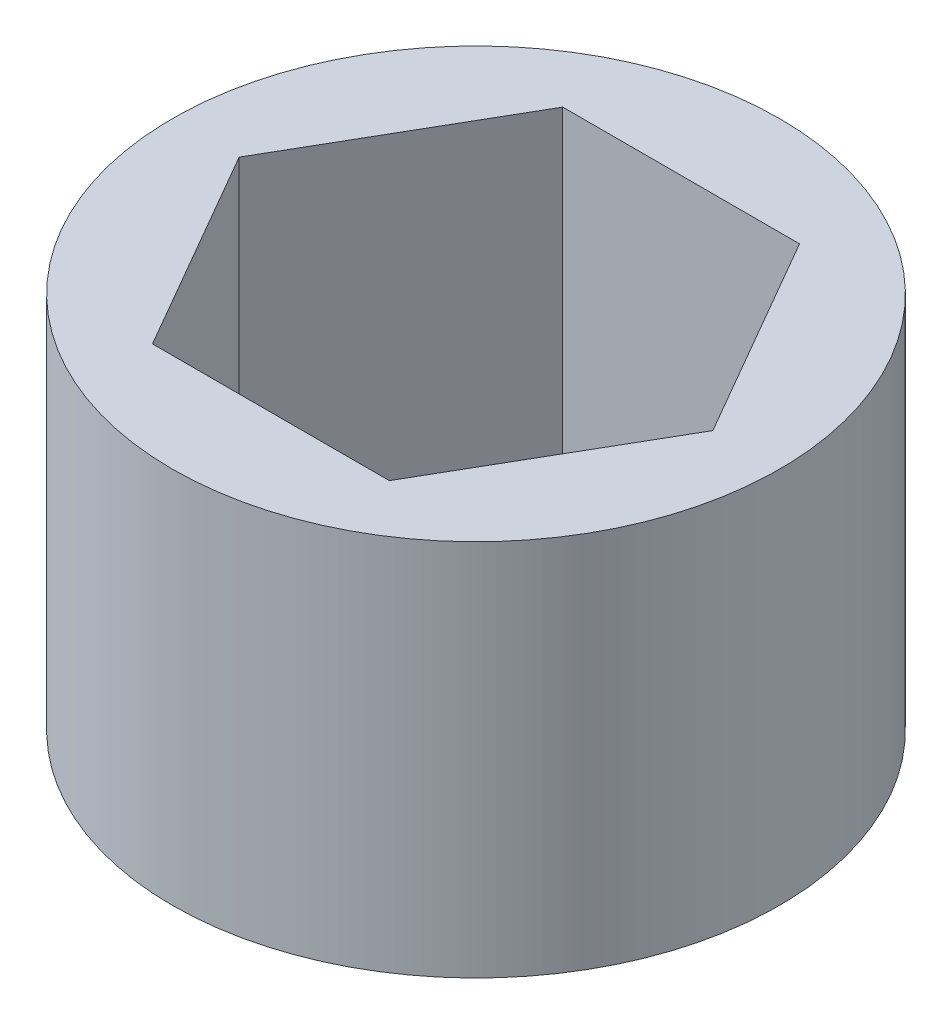
ISO-10303-21;
HEADER;
FILE_DESCRIPTION(('STEP AP214'),'2;1');
FILE_NAME('part.step','',(''),(''),'','','');
FILE_SCHEMA(('AUTOMOTIVE_DESIGN { 1 0 10303 214 1 1 1 1 }'));
ENDSEC;
DATA;
#1=APPLICATION_CONTEXT('core data for automotive mechanical design processes');
#2=APPLICATION_PROTOCOL_DEFINITION('international standard','automotive_design',2000,#1);
#3=PRODUCT_CONTEXT('',#1,'mechanical');
#4=PRODUCT('Part','Part','',(#3));
#5=PRODUCT_RELATED_PRODUCT_CATEGORY('part','',(#4));
#6=PRODUCT_DEFINITION_FORMATION('','',#4);
#7=PRODUCT_DEFINITION_CONTEXT('part definition',#1,'design');
#8=PRODUCT_DEFINITION('design','',#6,#7);
#9=PRODUCT_DEFINITION_SHAPE('','',#8);
#10=(LENGTH_UNIT() NAMED_UNIT(*) SI_UNIT(.MILLI.,.METRE.));
#11=(NAMED_UNIT(*) PLANE_ANGLE_UNIT() SI_UNIT($,.RADIAN.));
#12=(NAMED_UNIT(*) SI_UNIT($,.STERADIAN.) SOLID_ANGLE_UNIT());
#13=UNCERTAINTY_MEASURE_WITH_UNIT(LENGTH_MEASURE(1.E-05),#10,'distance_accuracy_value','');
#14=(GEOMETRIC_REPRESENTATION_CONTEXT(3) GLOBAL_UNCERTAINTY_ASSIGNED_CONTEXT((#13)) GLOBAL_UNIT_ASSIGNED_CONTEXT((#10,
#11,#12)) REPRESENTATION_CONTEXT('',''));
#15=CARTESIAN_POINT('',(0.,0.,0.));
#16=DIRECTION('',(0.,0.,1.));
#17=DIRECTION('',(1.,0.,0.));
#18=AXIS2_PLACEMENT_3D('',#15,#16,#17);
#19=CARTESIAN_POINT('',(0.,4.445,0.));
#20=DIRECTION('',(0.,1.,0.));
#21=DIRECTION('',(0.,0.,1.));
#22=AXIS2_PLACEMENT_3D('',#19,#20,#21);
#23=PLANE('',#22);
#24=CARTESIAN_POINT('',(0.,4.445,0.));
#25=DIRECTION('',(0.,1.,0.));
#26=DIRECTION('',(0.,0.,1.));
#27=AXIS2_PLACEMENT_3D('',#24,#25,#26);
#28=CIRCLE('',#27,7.14375);
#29=CARTESIAN_POINT('',(0.,4.445,7.14375));
#30=VERTEX_POINT('',#29);
#31=EDGE_CURVE('E11',#30,#30,#28,.T.);
#32=ORIENTED_EDGE('',*,*,#31,.T.);
#33=EDGE_LOOP('',(#32));
#34=FACE_BOUND('',#33,.T.);
#35=DIRECTION('',(0.5,0.,-0.866025403784439));
#36=VECTOR('',#35,1.);
#37=CARTESIAN_POINT('',(2.78629239910914,4.445,4.826));
#38=LINE('',#37,#36);
#39=CARTESIAN_POINT('',(2.78629239910914,4.445,4.826));
#40=VERTEX_POINT('',#39);
#41=CARTESIAN_POINT('',(5.57258479821827,4.445,0.));
#42=VERTEX_POINT('',#41);
#43=EDGE_CURVE('E95',#40,#42,#38,.T.);
#44=ORIENTED_EDGE('',*,*,#43,.F.);
#45=DIRECTION('',(1.,0.,0.));
#46=VECTOR('',#45,1.);
#47=CARTESIAN_POINT('',(-2.78629239910914,4.445,4.826));
#48=LINE('',#47,#46);
#49=CARTESIAN_POINT('',(-2.78629239910914,4.445,4.826));
#50=VERTEX_POINT('',#49);
#51=EDGE_CURVE('E87',#50,#40,#48,.T.);
#52=ORIENTED_EDGE('',*,*,#51,.F.);
#53=DIRECTION('',(0.5,0.,0.866025403784439));
#54=VECTOR('',#53,1.);
#55=CARTESIAN_POINT('',(-5.57258479821827,4.445,0.));
#56=LINE('',#55,#54);
#57=CARTESIAN_POINT('',(-5.57258479821827,4.445,0.));
#58=VERTEX_POINT('',#57);
#59=EDGE_CURVE('E115',#58,#50,#56,.T.);
#60=ORIENTED_EDGE('',*,*,#59,.F.);
#61=DIRECTION('',(-0.5,0.,0.866025403784439));
#62=VECTOR('',#61,1.);
#63=CARTESIAN_POINT('',(-2.78629239910914,4.445,-4.826));
#64=LINE('',#63,#62);
#65=CARTESIAN_POINT('',(-2.78629239910914,4.445,-4.826));
#66=VERTEX_POINT('',#65);
#67=EDGE_CURVE('E113',#66,#58,#64,.T.);
#68=ORIENTED_EDGE('',*,*,#67,.F.);
#69=DIRECTION('',(-1.,0.,0.));
#70=VECTOR('',#69,1.);
#71=CARTESIAN_POINT('',(2.78629239910914,4.445,-4.826));
#72=LINE('',#71,#70);
#73=CARTESIAN_POINT('',(2.78629239910914,4.445,-4.826));
#74=VERTEX_POINT('',#73);
#75=EDGE_CURVE('E109',#74,#66,#72,.T.);
#76=ORIENTED_EDGE('',*,*,#75,.F.);
#77=DIRECTION('',(-0.5,0.,-0.866025403784439));
#78=VECTOR('',#77,1.);
#79=CARTESIAN_POINT('',(5.57258479821827,4.445,0.));
#80=LINE('',#79,#78);
#81=EDGE_CURVE('E107',#42,#74,#80,.T.);
#82=ORIENTED_EDGE('',*,*,#81,.F.);
#83=EDGE_LOOP('',(#44,#52,#60,#68,#76,#82));
#84=FACE_BOUND('',#83,.T.);
#85=ADVANCED_FACE('F34',(#34,#84),#23,.T.);
#86=CARTESIAN_POINT('',(0.,-4.445,0.));
#87=DIRECTION('',(0.,1.,0.));
#88=DIRECTION('',(0.,0.,1.));
#89=AXIS2_PLACEMENT_3D('',#86,#87,#88);
#90=PLANE('',#89);
#91=CARTESIAN_POINT('',(0.,-4.445,0.));
#92=DIRECTION('',(0.,1.,0.));
#93=DIRECTION('',(0.,0.,1.));
#94=AXIS2_PLACEMENT_3D('',#91,#92,#93);
#95=CIRCLE('',#94,7.14375);
#96=CARTESIAN_POINT('',(0.,-4.445,7.14375));
#97=VERTEX_POINT('',#96);
#98=EDGE_CURVE('E38',#97,#97,#95,.T.);
#99=ORIENTED_EDGE('',*,*,#98,.F.);
#100=EDGE_LOOP('',(#99));
#101=FACE_BOUND('',#100,.T.);
#102=DIRECTION('',(1.,0.,0.));
#103=VECTOR('',#102,1.);
#104=CARTESIAN_POINT('',(-2.78629239910914,-4.445,4.826));
#105=LINE('',#104,#103);
#106=CARTESIAN_POINT('',(-2.78629239910914,-4.445,4.826));
#107=VERTEX_POINT('',#106);
#108=CARTESIAN_POINT('',(2.78629239910914,-4.445,4.826));
#109=VERTEX_POINT('',#108);
#110=EDGE_CURVE('E57',#107,#109,#105,.T.);
#111=ORIENTED_EDGE('',*,*,#110,.T.);
#112=DIRECTION('',(0.5,0.,-0.866025403784439));
#113=VECTOR('',#112,1.);
#114=CARTESIAN_POINT('',(2.78629239910914,-4.445,4.826));
#115=LINE('',#114,#113);
#116=CARTESIAN_POINT('',(5.57258479821827,-4.445,0.));
#117=VERTEX_POINT('',#116);
#118=EDGE_CURVE('E102',#109,#117,#115,.T.);
#119=ORIENTED_EDGE('',*,*,#118,.T.);
#120=DIRECTION('',(-0.5,0.,-0.866025403784439));
#121=VECTOR('',#120,1.);
#122=CARTESIAN_POINT('',(5.57258479821827,-4.445,0.));
#123=LINE('',#122,#121);
#124=CARTESIAN_POINT('',(2.78629239910914,-4.445,-4.826));
#125=VERTEX_POINT('',#124);
#126=EDGE_CURVE('E119',#117,#125,#123,.T.);
#127=ORIENTED_EDGE('',*,*,#126,.T.);
#128=DIRECTION('',(-1.,0.,0.));
#129=VECTOR('',#128,1.);
#130=CARTESIAN_POINT('',(2.78629239910914,-4.445,-4.826));
#131=LINE('',#130,#129);
#132=CARTESIAN_POINT('',(-2.78629239910914,-4.445,-4.826));
#133=VERTEX_POINT('',#132);
#134=EDGE_CURVE('E122',#125,#133,#131,.T.);
#135=ORIENTED_EDGE('',*,*,#134,.T.);
#136=DIRECTION('',(-0.5,0.,0.866025403784439));
#137=VECTOR('',#136,1.);
#138=CARTESIAN_POINT('',(-2.78629239910914,-4.445,-4.826));
#139=LINE('',#138,#137);
#140=CARTESIAN_POINT('',(-5.57258479821827,-4.445,0.));
#141=VERTEX_POINT('',#140);
#142=EDGE_CURVE('E125',#133,#141,#139,.T.);
#143=ORIENTED_EDGE('',*,*,#142,.T.);
#144=DIRECTION('',(0.5,0.,0.866025403784439));
#145=VECTOR('',#144,1.);
#146=CARTESIAN_POINT('',(-5.57258479821827,-4.445,0.));
#147=LINE('',#146,#145);
#148=EDGE_CURVE('E96',#141,#107,#147,.T.);
#149=ORIENTED_EDGE('',*,*,#148,.T.);
#150=EDGE_LOOP('',(#111,#119,#127,#135,#143,#149));
#151=FACE_BOUND('',#150,.T.);
#152=ADVANCED_FACE('F142',(#101,#151),#90,.F.);
#153=CARTESIAN_POINT('',(0.,4.445,0.));
#154=DIRECTION('',(0.,-1.,0.));
#155=DIRECTION('',(0.,0.,-1.));
#156=AXIS2_PLACEMENT_3D('',#153,#154,#155);
#157=CYLINDRICAL_SURFACE('',#156,7.14375);
#158=ORIENTED_EDGE('',*,*,#31,.F.);
#159=EDGE_LOOP('',(#158));
#160=FACE_BOUND('',#159,.T.);
#161=ORIENTED_EDGE('',*,*,#98,.T.);
#162=EDGE_LOOP('',(#161));
#163=FACE_BOUND('',#162,.T.);
#164=ADVANCED_FACE('F36',(#160,#163),#157,.T.);
#165=CARTESIAN_POINT('',(-2.78629239910914,4.445,4.826));
#166=DIRECTION('',(0.,0.,-1.));
#167=DIRECTION('',(-1.,0.,0.));
#168=AXIS2_PLACEMENT_3D('',#165,#166,#167);
#169=PLANE('',#168);
#170=ORIENTED_EDGE('',*,*,#110,.F.);
#171=DIRECTION('',(0.,-1.,0.));
#172=VECTOR('',#171,1.);
#173=CARTESIAN_POINT('',(-2.78629239910914,4.445,4.826));
#174=LINE('',#173,#172);
#175=EDGE_CURVE('E91',#50,#107,#174,.T.);
#176=ORIENTED_EDGE('',*,*,#175,.F.);
#177=ORIENTED_EDGE('',*,*,#51,.T.);
#178=DIRECTION('',(0.,-1.,0.));
#179=VECTOR('',#178,1.);
#180=CARTESIAN_POINT('',(2.78629239910914,4.445,4.826));
#181=LINE('',#180,#179);
#182=EDGE_CURVE('E90',#40,#109,#181,.T.);
#183=ORIENTED_EDGE('',*,*,#182,.T.);
#184=EDGE_LOOP('',(#170,#176,#177,#183));
#185=FACE_BOUND('',#184,.T.);
#186=ADVANCED_FACE('F89',(#185),#169,.T.);
#187=CARTESIAN_POINT('',(2.78629239910914,4.445,4.826));
#188=DIRECTION('',(-0.866025403784439,0.,-0.5));
#189=DIRECTION('',(-0.5,0.,0.866025403784439));
#190=AXIS2_PLACEMENT_3D('',#187,#188,#189);
#191=PLANE('',#190);
#192=ORIENTED_EDGE('',*,*,#118,.F.);
#193=ORIENTED_EDGE('',*,*,#182,.F.);
#194=ORIENTED_EDGE('',*,*,#43,.T.);
#195=DIRECTION('',(0.,-1.,0.));
#196=VECTOR('',#195,1.);
#197=CARTESIAN_POINT('',(5.57258479821827,4.445,0.));
#198=LINE('',#197,#196);
#199=EDGE_CURVE('E103',#42,#117,#198,.T.);
#200=ORIENTED_EDGE('',*,*,#199,.T.);
#201=EDGE_LOOP('',(#192,#193,#194,#200));
#202=FACE_BOUND('',#201,.T.);
#203=ADVANCED_FACE('F99',(#202),#191,.T.);
#204=CARTESIAN_POINT('',(5.57258479821827,4.445,0.));
#205=DIRECTION('',(-0.866025403784439,0.,0.5));
#206=DIRECTION('',(0.5,0.,0.866025403784439));
#207=AXIS2_PLACEMENT_3D('',#204,#205,#206);
#208=PLANE('',#207);
#209=ORIENTED_EDGE('',*,*,#126,.F.);
#210=ORIENTED_EDGE('',*,*,#199,.F.);
#211=ORIENTED_EDGE('',*,*,#81,.T.);
#212=DIRECTION('',(0.,-1.,0.));
#213=VECTOR('',#212,1.);
#214=CARTESIAN_POINT('',(2.78629239910914,4.445,-4.826));
#215=LINE('',#214,#213);
#216=EDGE_CURVE('E134',#74,#125,#215,.T.);
#217=ORIENTED_EDGE('',*,*,#216,.T.);
#218=EDGE_LOOP('',(#209,#210,#211,#217));
#219=FACE_BOUND('',#218,.T.);
#220=ADVANCED_FACE('F138',(#219),#208,.T.);
#221=CARTESIAN_POINT('',(2.78629239910914,4.445,-4.826));
#222=DIRECTION('',(0.,0.,1.));
#223=DIRECTION('',(1.,0.,0.));
#224=AXIS2_PLACEMENT_3D('',#221,#222,#223);
#225=PLANE('',#224);
#226=ORIENTED_EDGE('',*,*,#134,.F.);
#227=ORIENTED_EDGE('',*,*,#216,.F.);
#228=ORIENTED_EDGE('',*,*,#75,.T.);
#229=DIRECTION('',(0.,-1.,0.));
#230=VECTOR('',#229,1.);
#231=CARTESIAN_POINT('',(-2.78629239910914,4.445,-4.826));
#232=LINE('',#231,#230);
#233=EDGE_CURVE('E132',#66,#133,#232,.T.);
#234=ORIENTED_EDGE('',*,*,#233,.T.);
#235=EDGE_LOOP('',(#226,#227,#228,#234));
#236=FACE_BOUND('',#235,.T.);
#237=ADVANCED_FACE('F150',(#236),#225,.T.);
#238=CARTESIAN_POINT('',(-2.78629239910914,4.445,-4.826));
#239=DIRECTION('',(0.866025403784439,0.,0.5));
#240=DIRECTION('',(0.5,0.,-0.866025403784439));
#241=AXIS2_PLACEMENT_3D('',#238,#239,#240);
#242=PLANE('',#241);
#243=ORIENTED_EDGE('',*,*,#142,.F.);
#244=ORIENTED_EDGE('',*,*,#233,.F.);
#245=ORIENTED_EDGE('',*,*,#67,.T.);
#246=DIRECTION('',(0.,-1.,0.));
#247=VECTOR('',#246,1.);
#248=CARTESIAN_POINT('',(-5.57258479821827,4.445,0.));
#249=LINE('',#248,#247);
#250=EDGE_CURVE('E49',#58,#141,#249,.T.);
#251=ORIENTED_EDGE('',*,*,#250,.T.);
#252=EDGE_LOOP('',(#243,#244,#245,#251));
#253=FACE_BOUND('',#252,.T.);
#254=ADVANCED_FACE('F148',(#253),#242,.T.);
#255=CARTESIAN_POINT('',(-5.57258479821827,4.445,0.));
#256=DIRECTION('',(0.866025403784439,0.,-0.5));
#257=DIRECTION('',(-0.5,0.,-0.866025403784439));
#258=AXIS2_PLACEMENT_3D('',#255,#256,#257);
#259=PLANE('',#258);
#260=ORIENTED_EDGE('',*,*,#148,.F.);
#261=ORIENTED_EDGE('',*,*,#250,.F.);
#262=ORIENTED_EDGE('',*,*,#59,.T.);
#263=ORIENTED_EDGE('',*,*,#175,.T.);
#264=EDGE_LOOP('',(#260,#261,#262,#263));
#265=FACE_BOUND('',#264,.T.);
#266=ADVANCED_FACE('F144',(#265),#259,.T.);
#267=CLOSED_SHELL('',(#85,#152,#164,#186,#203,#220,#237,#254,#266));
#268=MANIFOLD_SOLID_BREP('B2',#267);
#269=ADVANCED_BREP_SHAPE_REPRESENTATION('',(#18,#268),#14);
#270=SHAPE_DEFINITION_REPRESENTATION(#9,#269);
ENDSEC;
END-ISO-10303-21;
